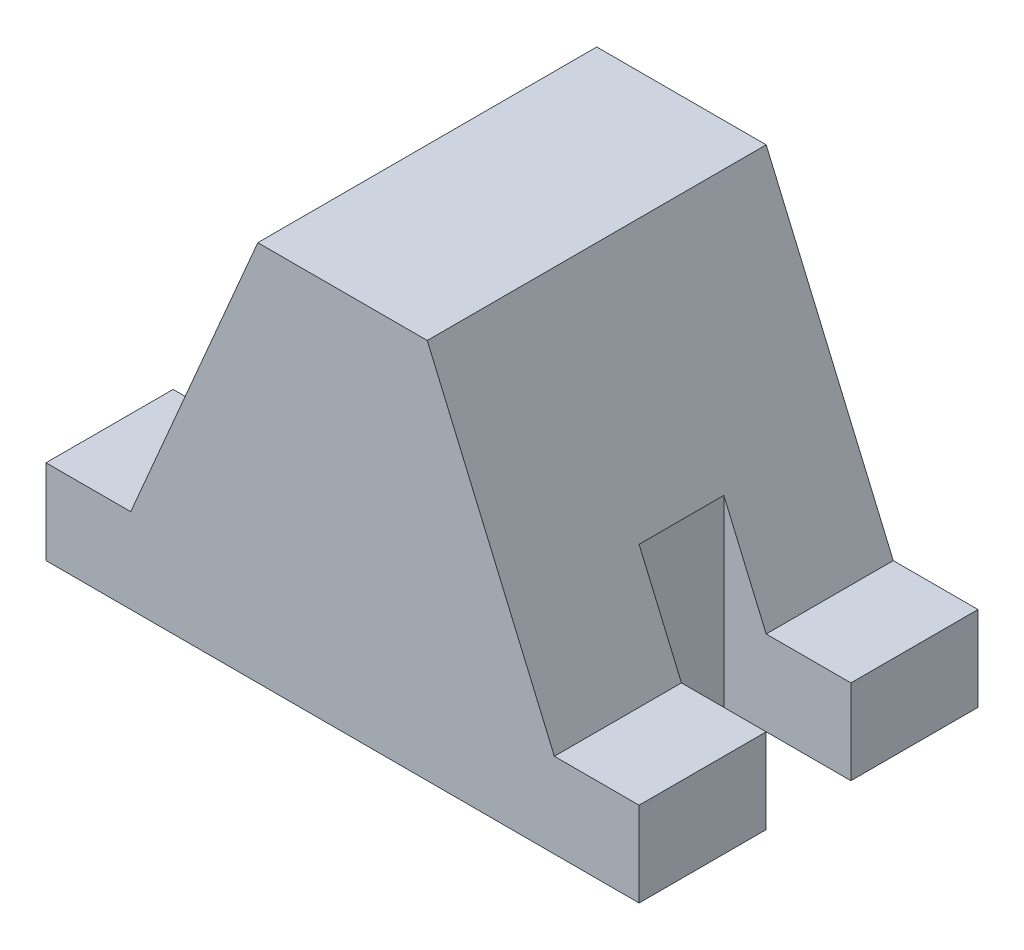
ISO-10303-21;
HEADER;
FILE_DESCRIPTION(('STEP AP214'),'2;1');
FILE_NAME('part.step','',(''),(''),'','','');
FILE_SCHEMA(('AUTOMOTIVE_DESIGN { 1 0 10303 214 1 1 1 1 }'));
ENDSEC;
DATA;
#1=APPLICATION_CONTEXT('core data for automotive mechanical design processes');
#2=APPLICATION_PROTOCOL_DEFINITION('international standard','automotive_design',2000,#1);
#3=PRODUCT_CONTEXT('',#1,'mechanical');
#4=PRODUCT('Part','Part','',(#3));
#5=PRODUCT_RELATED_PRODUCT_CATEGORY('part','',(#4));
#6=PRODUCT_DEFINITION_FORMATION('','',#4);
#7=PRODUCT_DEFINITION_CONTEXT('part definition',#1,'design');
#8=PRODUCT_DEFINITION('design','',#6,#7);
#9=PRODUCT_DEFINITION_SHAPE('','',#8);
#10=(LENGTH_UNIT() NAMED_UNIT(*) SI_UNIT(.MILLI.,.METRE.));
#11=(NAMED_UNIT(*) PLANE_ANGLE_UNIT() SI_UNIT($,.RADIAN.));
#12=(NAMED_UNIT(*) SI_UNIT($,.STERADIAN.) SOLID_ANGLE_UNIT());
#13=UNCERTAINTY_MEASURE_WITH_UNIT(LENGTH_MEASURE(1.E-05),#10,'distance_accuracy_value','');
#14=(GEOMETRIC_REPRESENTATION_CONTEXT(3) GLOBAL_UNCERTAINTY_ASSIGNED_CONTEXT((#13)) GLOBAL_UNIT_ASSIGNED_CONTEXT((#10,
#11,#12)) REPRESENTATION_CONTEXT('',''));
#15=CARTESIAN_POINT('',(0.,0.,0.));
#16=DIRECTION('',(0.,0.,1.));
#17=DIRECTION('',(1.,0.,0.));
#18=AXIS2_PLACEMENT_3D('',#15,#16,#17);
#19=CARTESIAN_POINT('',(-35.,10.,20.));
#20=DIRECTION('',(1.,0.,0.));
#21=DIRECTION('',(0.,0.,-1.));
#22=AXIS2_PLACEMENT_3D('',#19,#20,#21);
#23=PLANE('',#22);
#24=DIRECTION('',(0.,0.,-1.));
#25=VECTOR('',#24,1.);
#26=CARTESIAN_POINT('',(-35.,10.,20.));
#27=LINE('',#26,#25);
#28=CARTESIAN_POINT('',(-35.,10.,20.));
#29=VERTEX_POINT('',#28);
#30=CARTESIAN_POINT('',(-35.,10.,5.00000000000002));
#31=VERTEX_POINT('',#30);
#32=EDGE_CURVE('E177',#29,#31,#27,.T.);
#33=ORIENTED_EDGE('',*,*,#32,.T.);
#34=DIRECTION('',(0.,-1.,0.));
#35=VECTOR('',#34,1.);
#36=CARTESIAN_POINT('',(-35.,45.001,5.00000000000002));
#37=LINE('',#36,#35);
#38=CARTESIAN_POINT('',(-35.,0.,5.00000000000002));
#39=VERTEX_POINT('',#38);
#40=EDGE_CURVE('E158',#31,#39,#37,.T.);
#41=ORIENTED_EDGE('',*,*,#40,.T.);
#42=DIRECTION('',(0.,0.,-1.));
#43=VECTOR('',#42,1.);
#44=CARTESIAN_POINT('',(-35.,0.,20.));
#45=LINE('',#44,#43);
#46=CARTESIAN_POINT('',(-35.,0.,20.));
#47=VERTEX_POINT('',#46);
#48=EDGE_CURVE('E11',#47,#39,#45,.T.);
#49=ORIENTED_EDGE('',*,*,#48,.F.);
#50=DIRECTION('',(0.,-1.,0.));
#51=VECTOR('',#50,1.);
#52=CARTESIAN_POINT('',(-35.,10.,20.));
#53=LINE('',#52,#51);
#54=EDGE_CURVE('E185',#29,#47,#53,.T.);
#55=ORIENTED_EDGE('',*,*,#54,.F.);
#56=EDGE_LOOP('',(#33,#41,#49,#55));
#57=FACE_BOUND('',#56,.T.);
#58=ADVANCED_FACE('F33',(#57),#23,.F.);
#59=CARTESIAN_POINT('',(-25.,10.,20.));
#60=DIRECTION('',(0.,-1.,0.));
#61=DIRECTION('',(1.,0.,0.));
#62=AXIS2_PLACEMENT_3D('',#59,#60,#61);
#63=PLANE('',#62);
#64=DIRECTION('',(0.,0.,-1.));
#65=VECTOR('',#64,1.);
#66=CARTESIAN_POINT('',(-25.,10.,20.));
#67=LINE('',#66,#65);
#68=CARTESIAN_POINT('',(-25.,10.,20.));
#69=VERTEX_POINT('',#68);
#70=CARTESIAN_POINT('',(-25.,10.,5.));
#71=VERTEX_POINT('',#70);
#72=EDGE_CURVE('E180',#69,#71,#67,.T.);
#73=ORIENTED_EDGE('',*,*,#72,.T.);
#74=DIRECTION('',(1.,0.,0.));
#75=VECTOR('',#74,1.);
#76=CARTESIAN_POINT('',(-20.,10.,4.99999999999999));
#77=LINE('',#76,#75);
#78=EDGE_CURVE('E162',#31,#71,#77,.T.);
#79=ORIENTED_EDGE('',*,*,#78,.F.);
#80=ORIENTED_EDGE('',*,*,#32,.F.);
#81=DIRECTION('',(-1.,0.,0.));
#82=VECTOR('',#81,1.);
#83=CARTESIAN_POINT('',(-25.,10.,20.));
#84=LINE('',#83,#82);
#85=EDGE_CURVE('E190',#69,#29,#84,.T.);
#86=ORIENTED_EDGE('',*,*,#85,.F.);
#87=EDGE_LOOP('',(#73,#79,#80,#86));
#88=FACE_BOUND('',#87,.T.);
#89=ADVANCED_FACE('F175',(#88),#63,.F.);
#90=CARTESIAN_POINT('',(35.,0.,20.));
#91=DIRECTION('',(-1.,0.,0.));
#92=DIRECTION('',(0.,0.,1.));
#93=AXIS2_PLACEMENT_3D('',#90,#91,#92);
#94=PLANE('',#93);
#95=DIRECTION('',(0.,0.,-1.));
#96=VECTOR('',#95,1.);
#97=CARTESIAN_POINT('',(35.,0.,20.));
#98=LINE('',#97,#96);
#99=CARTESIAN_POINT('',(35.,0.,20.));
#100=VERTEX_POINT('',#99);
#101=CARTESIAN_POINT('',(35.,0.,5.00000000000002));
#102=VERTEX_POINT('',#101);
#103=EDGE_CURVE('E209',#100,#102,#98,.T.);
#104=ORIENTED_EDGE('',*,*,#103,.T.);
#105=DIRECTION('',(0.,-1.,0.));
#106=VECTOR('',#105,1.);
#107=CARTESIAN_POINT('',(35.,45.001,5.00000000000002));
#108=LINE('',#107,#106);
#109=CARTESIAN_POINT('',(35.,10.,5.00000000000002));
#110=VERTEX_POINT('',#109);
#111=EDGE_CURVE('E279',#110,#102,#108,.T.);
#112=ORIENTED_EDGE('',*,*,#111,.F.);
#113=DIRECTION('',(0.,0.,-1.));
#114=VECTOR('',#113,1.);
#115=CARTESIAN_POINT('',(35.,10.,20.));
#116=LINE('',#115,#114);
#117=CARTESIAN_POINT('',(35.,10.,20.));
#118=VERTEX_POINT('',#117);
#119=EDGE_CURVE('E206',#118,#110,#116,.T.);
#120=ORIENTED_EDGE('',*,*,#119,.F.);
#121=DIRECTION('',(0.,1.,0.));
#122=VECTOR('',#121,1.);
#123=CARTESIAN_POINT('',(35.,0.,20.));
#124=LINE('',#123,#122);
#125=EDGE_CURVE('E261',#100,#118,#124,.T.);
#126=ORIENTED_EDGE('',*,*,#125,.F.);
#127=EDGE_LOOP('',(#104,#112,#120,#126));
#128=FACE_BOUND('',#127,.T.);
#129=ADVANCED_FACE('F333',(#128),#94,.F.);
#130=CARTESIAN_POINT('',(35.,10.,20.));
#131=DIRECTION('',(0.,-1.,0.));
#132=DIRECTION('',(1.,0.,0.));
#133=AXIS2_PLACEMENT_3D('',#130,#131,#132);
#134=PLANE('',#133);
#135=ORIENTED_EDGE('',*,*,#119,.T.);
#136=DIRECTION('',(1.,0.,0.));
#137=VECTOR('',#136,1.);
#138=CARTESIAN_POINT('',(20.,9.99999999999999,4.99999999999999));
#139=LINE('',#138,#137);
#140=CARTESIAN_POINT('',(25.,10.,5.));
#141=VERTEX_POINT('',#140);
#142=EDGE_CURVE('E294',#141,#110,#139,.T.);
#143=ORIENTED_EDGE('',*,*,#142,.F.);
#144=DIRECTION('',(0.,0.,-1.));
#145=VECTOR('',#144,1.);
#146=CARTESIAN_POINT('',(25.,10.,20.));
#147=LINE('',#146,#145);
#148=CARTESIAN_POINT('',(25.,10.,20.));
#149=VERTEX_POINT('',#148);
#150=EDGE_CURVE('E202',#149,#141,#147,.T.);
#151=ORIENTED_EDGE('',*,*,#150,.F.);
#152=DIRECTION('',(-1.,0.,0.));
#153=VECTOR('',#152,1.);
#154=CARTESIAN_POINT('',(35.,10.,20.));
#155=LINE('',#154,#153);
#156=EDGE_CURVE('E267',#118,#149,#155,.T.);
#157=ORIENTED_EDGE('',*,*,#156,.F.);
#158=EDGE_LOOP('',(#135,#143,#151,#157));
#159=FACE_BOUND('',#158,.T.);
#160=ADVANCED_FACE('F338',(#159),#134,.F.);
#161=CARTESIAN_POINT('',(-35.,0.,-4.99999999999998));
#162=VERTEX_POINT('',#161);
#163=CARTESIAN_POINT('',(-35.,0.,-20.));
#164=VERTEX_POINT('',#163);
#165=EDGE_CURVE('E41',#162,#164,#45,.T.);
#166=ORIENTED_EDGE('',*,*,#165,.F.);
#167=DIRECTION('',(0.,-1.,0.));
#168=VECTOR('',#167,1.);
#169=CARTESIAN_POINT('',(-35.,45.001,-4.99999999999998));
#170=LINE('',#169,#168);
#171=CARTESIAN_POINT('',(-35.,10.,-4.99999999999998));
#172=VERTEX_POINT('',#171);
#173=EDGE_CURVE('E169',#172,#162,#170,.T.);
#174=ORIENTED_EDGE('',*,*,#173,.F.);
#175=CARTESIAN_POINT('',(-35.,10.,-20.));
#176=VERTEX_POINT('',#175);
#177=EDGE_CURVE('E187',#172,#176,#27,.T.);
#178=ORIENTED_EDGE('',*,*,#177,.T.);
#179=DIRECTION('',(0.,-1.,0.));
#180=VECTOR('',#179,1.);
#181=CARTESIAN_POINT('',(-35.,10.,-20.));
#182=LINE('',#181,#180);
#183=EDGE_CURVE('E236',#176,#164,#182,.T.);
#184=ORIENTED_EDGE('',*,*,#183,.T.);
#185=EDGE_LOOP('',(#166,#174,#178,#184));
#186=FACE_BOUND('',#185,.T.);
#187=ADVANCED_FACE('F35',(#186),#23,.F.);
#188=CARTESIAN_POINT('',(-35.,0.,20.));
#189=DIRECTION('',(0.,1.,0.));
#190=DIRECTION('',(-1.,0.,0.));
#191=AXIS2_PLACEMENT_3D('',#188,#189,#190);
#192=PLANE('',#191);
#193=ORIENTED_EDGE('',*,*,#48,.T.);
#194=DIRECTION('',(-1.,0.,0.));
#195=VECTOR('',#194,1.);
#196=CARTESIAN_POINT('',(-20.,0.,4.99999999999999));
#197=LINE('',#196,#195);
#198=CARTESIAN_POINT('',(-20.,0.,4.99999999999999));
#199=VERTEX_POINT('',#198);
#200=EDGE_CURVE('E165',#199,#39,#197,.T.);
#201=ORIENTED_EDGE('',*,*,#200,.F.);
#202=DIRECTION('',(0.,0.,1.));
#203=VECTOR('',#202,1.);
#204=CARTESIAN_POINT('',(-20.,0.,4.99999999999999));
#205=LINE('',#204,#203);
#206=CARTESIAN_POINT('',(-20.,0.,-4.99999999999996));
#207=VERTEX_POINT('',#206);
#208=EDGE_CURVE('E170',#207,#199,#205,.T.);
#209=ORIENTED_EDGE('',*,*,#208,.F.);
#210=DIRECTION('',(1.,0.,0.));
#211=VECTOR('',#210,1.);
#212=CARTESIAN_POINT('',(-20.,0.,-4.99999999999996));
#213=LINE('',#212,#211);
#214=EDGE_CURVE('E309',#162,#207,#213,.T.);
#215=ORIENTED_EDGE('',*,*,#214,.F.);
#216=ORIENTED_EDGE('',*,*,#165,.T.);
#217=DIRECTION('',(1.,0.,0.));
#218=VECTOR('',#217,1.);
#219=CARTESIAN_POINT('',(-35.,0.,-20.));
#220=LINE('',#219,#218);
#221=CARTESIAN_POINT('',(35.,0.,-20.));
#222=VERTEX_POINT('',#221);
#223=EDGE_CURVE('E229',#164,#222,#220,.T.);
#224=ORIENTED_EDGE('',*,*,#223,.T.);
#225=CARTESIAN_POINT('',(35.,0.,-4.99999999999998));
#226=VERTEX_POINT('',#225);
#227=EDGE_CURVE('E208',#226,#222,#98,.T.);
#228=ORIENTED_EDGE('',*,*,#227,.F.);
#229=DIRECTION('',(1.,0.,0.));
#230=VECTOR('',#229,1.);
#231=CARTESIAN_POINT('',(20.,0.,-4.99999999999996));
#232=LINE('',#231,#230);
#233=CARTESIAN_POINT('',(20.,0.,-4.99999999999996));
#234=VERTEX_POINT('',#233);
#235=EDGE_CURVE('E289',#234,#226,#232,.T.);
#236=ORIENTED_EDGE('',*,*,#235,.F.);
#237=DIRECTION('',(0.,0.,-1.));
#238=VECTOR('',#237,1.);
#239=CARTESIAN_POINT('',(20.,0.,4.99999999999999));
#240=LINE('',#239,#238);
#241=CARTESIAN_POINT('',(20.,0.,4.99999999999999));
#242=VERTEX_POINT('',#241);
#243=EDGE_CURVE('E291',#242,#234,#240,.T.);
#244=ORIENTED_EDGE('',*,*,#243,.F.);
#245=DIRECTION('',(-1.,0.,0.));
#246=VECTOR('',#245,1.);
#247=CARTESIAN_POINT('',(20.,0.,4.99999999999999));
#248=LINE('',#247,#246);
#249=EDGE_CURVE('E284',#102,#242,#248,.T.);
#250=ORIENTED_EDGE('',*,*,#249,.F.);
#251=ORIENTED_EDGE('',*,*,#103,.F.);
#252=DIRECTION('',(1.,0.,0.));
#253=VECTOR('',#252,1.);
#254=CARTESIAN_POINT('',(-35.,0.,20.));
#255=LINE('',#254,#253);
#256=EDGE_CURVE('E258',#47,#100,#255,.T.);
#257=ORIENTED_EDGE('',*,*,#256,.F.);
#258=EDGE_LOOP('',(#193,#201,#209,#215,#216,#224,#228,#236,#244,#250,#251,#257));
#259=FACE_BOUND('',#258,.T.);
#260=ADVANCED_FACE('F230',(#259),#192,.F.);
#261=CARTESIAN_POINT('',(35.,10.,-4.99999999999998));
#262=VERTEX_POINT('',#261);
#263=CARTESIAN_POINT('',(35.,10.,-20.));
#264=VERTEX_POINT('',#263);
#265=EDGE_CURVE('E205',#262,#264,#116,.T.);
#266=ORIENTED_EDGE('',*,*,#265,.F.);
#267=DIRECTION('',(0.,-1.,0.));
#268=VECTOR('',#267,1.);
#269=CARTESIAN_POINT('',(35.,45.001,-4.99999999999998));
#270=LINE('',#269,#268);
#271=EDGE_CURVE('E225',#262,#226,#270,.T.);
#272=ORIENTED_EDGE('',*,*,#271,.T.);
#273=ORIENTED_EDGE('',*,*,#227,.T.);
#274=DIRECTION('',(0.,1.,0.));
#275=VECTOR('',#274,1.);
#276=CARTESIAN_POINT('',(35.,0.,-20.));
#277=LINE('',#276,#275);
#278=EDGE_CURVE('E223',#222,#264,#277,.T.);
#279=ORIENTED_EDGE('',*,*,#278,.T.);
#280=EDGE_LOOP('',(#266,#272,#273,#279));
#281=FACE_BOUND('',#280,.T.);
#282=ADVANCED_FACE('F221',(#281),#94,.F.);
#283=CARTESIAN_POINT('',(25.,10.,-4.99999999999997));
#284=VERTEX_POINT('',#283);
#285=CARTESIAN_POINT('',(25.,10.,-20.));
#286=VERTEX_POINT('',#285);
#287=EDGE_CURVE('E201',#284,#286,#147,.T.);
#288=ORIENTED_EDGE('',*,*,#287,.F.);
#289=DIRECTION('',(-1.,0.,0.));
#290=VECTOR('',#289,1.);
#291=CARTESIAN_POINT('',(20.,9.99999999999999,-4.99999999999996));
#292=LINE('',#291,#290);
#293=EDGE_CURVE('E56',#262,#284,#292,.T.);
#294=ORIENTED_EDGE('',*,*,#293,.F.);
#295=ORIENTED_EDGE('',*,*,#265,.T.);
#296=DIRECTION('',(-1.,0.,0.));
#297=VECTOR('',#296,1.);
#298=CARTESIAN_POINT('',(35.,10.,-20.));
#299=LINE('',#298,#297);
#300=EDGE_CURVE('E241',#264,#286,#299,.T.);
#301=ORIENTED_EDGE('',*,*,#300,.T.);
#302=EDGE_LOOP('',(#288,#294,#295,#301));
#303=FACE_BOUND('',#302,.T.);
#304=ADVANCED_FACE('F345',(#303),#134,.F.);
#305=CARTESIAN_POINT('',(25.,10.,20.));
#306=DIRECTION('',(-0.919145030018058,-0.393919298579168,0.));
#307=DIRECTION('',(0.393919298579168,-0.919145030018058,0.));
#308=AXIS2_PLACEMENT_3D('',#305,#306,#307);
#309=PLANE('',#308);
#310=ORIENTED_EDGE('',*,*,#150,.T.);
#311=DIRECTION('',(0.393919298579168,-0.919145030018058,0.));
#312=VECTOR('',#311,1.);
#313=CARTESIAN_POINT('',(11.5513620689655,41.3801551724138,4.99999999999997));
#314=LINE('',#313,#312);
#315=CARTESIAN_POINT('',(20.,21.6666666666667,4.99999999999999));
#316=VERTEX_POINT('',#315);
#317=EDGE_CURVE('E296',#316,#141,#314,.T.);
#318=ORIENTED_EDGE('',*,*,#317,.F.);
#319=DIRECTION('',(0.,0.,1.));
#320=VECTOR('',#319,1.);
#321=CARTESIAN_POINT('',(20.,21.6666666666667,4.99999999999999));
#322=LINE('',#321,#320);
#323=CARTESIAN_POINT('',(20.,21.6666666666667,-4.99999999999996));
#324=VERTEX_POINT('',#323);
#325=EDGE_CURVE('E298',#324,#316,#322,.T.);
#326=ORIENTED_EDGE('',*,*,#325,.F.);
#327=DIRECTION('',(-0.393919298579168,0.919145030018058,0.));
#328=VECTOR('',#327,1.);
#329=CARTESIAN_POINT('',(11.5513620689655,41.3801551724138,-4.99999999999995));
#330=LINE('',#329,#328);
#331=EDGE_CURVE('E276',#284,#324,#330,.T.);
#332=ORIENTED_EDGE('',*,*,#331,.F.);
#333=ORIENTED_EDGE('',*,*,#287,.T.);
#334=DIRECTION('',(-0.393919298579168,0.919145030018058,0.));
#335=VECTOR('',#334,1.);
#336=CARTESIAN_POINT('',(25.,10.,-20.));
#337=LINE('',#336,#335);
#338=CARTESIAN_POINT('',(10.,45.,-20.));
#339=VERTEX_POINT('',#338);
#340=EDGE_CURVE('E243',#286,#339,#337,.T.);
#341=ORIENTED_EDGE('',*,*,#340,.T.);
#342=DIRECTION('',(0.,0.,-1.));
#343=VECTOR('',#342,1.);
#344=CARTESIAN_POINT('',(10.,45.,20.));
#345=LINE('',#344,#343);
#346=CARTESIAN_POINT('',(10.,45.,20.));
#347=VERTEX_POINT('',#346);
#348=EDGE_CURVE('E198',#347,#339,#345,.T.);
#349=ORIENTED_EDGE('',*,*,#348,.F.);
#350=DIRECTION('',(-0.393919298579168,0.919145030018058,0.));
#351=VECTOR('',#350,1.);
#352=CARTESIAN_POINT('',(25.,10.,20.));
#353=LINE('',#352,#351);
#354=EDGE_CURVE('E269',#149,#347,#353,.T.);
#355=ORIENTED_EDGE('',*,*,#354,.F.);
#356=EDGE_LOOP('',(#310,#318,#326,#332,#333,#341,#349,#355));
#357=FACE_BOUND('',#356,.T.);
#358=ADVANCED_FACE('F352',(#357),#309,.F.);
#359=CARTESIAN_POINT('',(10.,45.,20.));
#360=DIRECTION('',(0.,-1.,0.));
#361=DIRECTION('',(0.,0.,-1.));
#362=AXIS2_PLACEMENT_3D('',#359,#360,#361);
#363=PLANE('',#362);
#364=DIRECTION('',(-1.,0.,0.));
#365=VECTOR('',#364,1.);
#366=CARTESIAN_POINT('',(10.,45.,-20.));
#367=LINE('',#366,#365);
#368=CARTESIAN_POINT('',(-10.,45.,-20.));
#369=VERTEX_POINT('',#368);
#370=EDGE_CURVE('E248',#339,#369,#367,.T.);
#371=ORIENTED_EDGE('',*,*,#370,.T.);
#372=DIRECTION('',(0.,0.,-1.));
#373=VECTOR('',#372,1.);
#374=CARTESIAN_POINT('',(-10.,45.,20.));
#375=LINE('',#374,#373);
#376=CARTESIAN_POINT('',(-10.,45.,20.));
#377=VERTEX_POINT('',#376);
#378=EDGE_CURVE('E195',#377,#369,#375,.T.);
#379=ORIENTED_EDGE('',*,*,#378,.F.);
#380=DIRECTION('',(-1.,0.,0.));
#381=VECTOR('',#380,1.);
#382=CARTESIAN_POINT('',(10.,45.,20.));
#383=LINE('',#382,#381);
#384=EDGE_CURVE('E271',#347,#377,#383,.T.);
#385=ORIENTED_EDGE('',*,*,#384,.F.);
#386=ORIENTED_EDGE('',*,*,#348,.T.);
#387=EDGE_LOOP('',(#371,#379,#385,#386));
#388=FACE_BOUND('',#387,.T.);
#389=ADVANCED_FACE('F329',(#388),#363,.F.);
#390=CARTESIAN_POINT('',(-10.,45.,20.));
#391=DIRECTION('',(0.919145030018058,-0.393919298579168,0.));
#392=DIRECTION('',(0.393919298579168,0.919145030018058,0.));
#393=AXIS2_PLACEMENT_3D('',#390,#391,#392);
#394=PLANE('',#393);
#395=DIRECTION('',(0.,0.,-1.));
#396=VECTOR('',#395,1.);
#397=CARTESIAN_POINT('',(-20.,21.6666666666667,4.99999999999999));
#398=LINE('',#397,#396);
#399=CARTESIAN_POINT('',(-20.,21.6666666666667,4.99999999999999));
#400=VERTEX_POINT('',#399);
#401=CARTESIAN_POINT('',(-20.,21.6666666666666,-4.99999999999996));
#402=VERTEX_POINT('',#401);
#403=EDGE_CURVE('E181',#400,#402,#398,.T.);
#404=ORIENTED_EDGE('',*,*,#403,.F.);
#405=DIRECTION('',(0.393919298579168,0.919145030018058,0.));
#406=VECTOR('',#405,1.);
#407=CARTESIAN_POINT('',(-11.5513620689655,41.3801551724138,4.99999999999997));
#408=LINE('',#407,#406);
#409=EDGE_CURVE('E313',#71,#400,#408,.T.);
#410=ORIENTED_EDGE('',*,*,#409,.F.);
#411=ORIENTED_EDGE('',*,*,#72,.F.);
#412=DIRECTION('',(-0.393919298579168,-0.919145030018058,0.));
#413=VECTOR('',#412,1.);
#414=CARTESIAN_POINT('',(-10.,45.,20.));
#415=LINE('',#414,#413);
#416=EDGE_CURVE('E273',#377,#69,#415,.T.);
#417=ORIENTED_EDGE('',*,*,#416,.F.);
#418=ORIENTED_EDGE('',*,*,#378,.T.);
#419=DIRECTION('',(-0.393919298579168,-0.919145030018058,0.));
#420=VECTOR('',#419,1.);
#421=CARTESIAN_POINT('',(-10.,45.,-20.));
#422=LINE('',#421,#420);
#423=CARTESIAN_POINT('',(-25.,10.,-20.));
#424=VERTEX_POINT('',#423);
#425=EDGE_CURVE('E249',#369,#424,#422,.T.);
#426=ORIENTED_EDGE('',*,*,#425,.T.);
#427=CARTESIAN_POINT('',(-25.,10.,-4.99999999999997));
#428=VERTEX_POINT('',#427);
#429=EDGE_CURVE('E186',#428,#424,#67,.T.);
#430=ORIENTED_EDGE('',*,*,#429,.F.);
#431=DIRECTION('',(-0.393919298579168,-0.919145030018058,0.));
#432=VECTOR('',#431,1.);
#433=CARTESIAN_POINT('',(-11.5513620689655,41.3801551724138,-4.99999999999995));
#434=LINE('',#433,#432);
#435=EDGE_CURVE('E48',#402,#428,#434,.T.);
#436=ORIENTED_EDGE('',*,*,#435,.F.);
#437=EDGE_LOOP('',(#404,#410,#411,#417,#418,#426,#430,#436));
#438=FACE_BOUND('',#437,.T.);
#439=ADVANCED_FACE('F322',(#438),#394,.F.);
#440=ORIENTED_EDGE('',*,*,#177,.F.);
#441=DIRECTION('',(-1.,0.,0.));
#442=VECTOR('',#441,1.);
#443=CARTESIAN_POINT('',(-20.,10.,-4.99999999999996));
#444=LINE('',#443,#442);
#445=EDGE_CURVE('E182',#428,#172,#444,.T.);
#446=ORIENTED_EDGE('',*,*,#445,.F.);
#447=ORIENTED_EDGE('',*,*,#429,.T.);
#448=DIRECTION('',(-1.,0.,0.));
#449=VECTOR('',#448,1.);
#450=CARTESIAN_POINT('',(-25.,10.,-20.));
#451=LINE('',#450,#449);
#452=EDGE_CURVE('E192',#424,#176,#451,.T.);
#453=ORIENTED_EDGE('',*,*,#452,.T.);
#454=EDGE_LOOP('',(#440,#446,#447,#453));
#455=FACE_BOUND('',#454,.T.);
#456=ADVANCED_FACE('F319',(#455),#63,.F.);
#457=CARTESIAN_POINT('',(0.,0.,20.));
#458=DIRECTION('',(0.,0.,1.));
#459=DIRECTION('',(1.,0.,0.));
#460=AXIS2_PLACEMENT_3D('',#457,#458,#459);
#461=PLANE('',#460);
#462=ORIENTED_EDGE('',*,*,#54,.T.);
#463=ORIENTED_EDGE('',*,*,#256,.T.);
#464=ORIENTED_EDGE('',*,*,#125,.T.);
#465=ORIENTED_EDGE('',*,*,#156,.T.);
#466=ORIENTED_EDGE('',*,*,#354,.T.);
#467=ORIENTED_EDGE('',*,*,#384,.T.);
#468=ORIENTED_EDGE('',*,*,#416,.T.);
#469=ORIENTED_EDGE('',*,*,#85,.T.);
#470=EDGE_LOOP('',(#462,#463,#464,#465,#466,#467,#468,#469));
#471=FACE_BOUND('',#470,.T.);
#472=ADVANCED_FACE('F321',(#471),#461,.T.);
#473=CARTESIAN_POINT('',(0.,0.,-20.));
#474=DIRECTION('',(0.,0.,1.));
#475=DIRECTION('',(1.,0.,0.));
#476=AXIS2_PLACEMENT_3D('',#473,#474,#475);
#477=PLANE('',#476);
#478=ORIENTED_EDGE('',*,*,#183,.F.);
#479=ORIENTED_EDGE('',*,*,#452,.F.);
#480=ORIENTED_EDGE('',*,*,#425,.F.);
#481=ORIENTED_EDGE('',*,*,#370,.F.);
#482=ORIENTED_EDGE('',*,*,#340,.F.);
#483=ORIENTED_EDGE('',*,*,#300,.F.);
#484=ORIENTED_EDGE('',*,*,#278,.F.);
#485=ORIENTED_EDGE('',*,*,#223,.F.);
#486=EDGE_LOOP('',(#478,#479,#480,#481,#482,#483,#484,#485));
#487=FACE_BOUND('',#486,.T.);
#488=ADVANCED_FACE('F238',(#487),#477,.F.);
#489=CARTESIAN_POINT('',(20.,45.001,4.99999999999999));
#490=DIRECTION('',(-1.,0.,0.));
#491=DIRECTION('',(0.,-1.,0.));
#492=AXIS2_PLACEMENT_3D('',#489,#490,#491);
#493=PLANE('',#492);
#494=ORIENTED_EDGE('',*,*,#325,.T.);
#495=DIRECTION('',(0.,-1.,0.));
#496=VECTOR('',#495,1.);
#497=CARTESIAN_POINT('',(20.,45.001,4.99999999999999));
#498=LINE('',#497,#496);
#499=EDGE_CURVE('E277',#316,#242,#498,.T.);
#500=ORIENTED_EDGE('',*,*,#499,.T.);
#501=ORIENTED_EDGE('',*,*,#243,.T.);
#502=DIRECTION('',(0.,-1.,0.));
#503=VECTOR('',#502,1.);
#504=CARTESIAN_POINT('',(20.,45.001,-4.99999999999996));
#505=LINE('',#504,#503);
#506=EDGE_CURVE('E282',#324,#234,#505,.T.);
#507=ORIENTED_EDGE('',*,*,#506,.F.);
#508=EDGE_LOOP('',(#494,#500,#501,#507));
#509=FACE_BOUND('',#508,.T.);
#510=ADVANCED_FACE('F363',(#509),#493,.F.);
#511=CARTESIAN_POINT('',(20.,45.001,4.99999999999999));
#512=DIRECTION('',(0.,0.,1.));
#513=DIRECTION('',(1.,0.,0.));
#514=AXIS2_PLACEMENT_3D('',#511,#512,#513);
#515=PLANE('',#514);
#516=ORIENTED_EDGE('',*,*,#142,.T.);
#517=ORIENTED_EDGE('',*,*,#111,.T.);
#518=ORIENTED_EDGE('',*,*,#249,.T.);
#519=ORIENTED_EDGE('',*,*,#499,.F.);
#520=ORIENTED_EDGE('',*,*,#317,.T.);
#521=EDGE_LOOP('',(#516,#517,#518,#519,#520));
#522=FACE_BOUND('',#521,.T.);
#523=ADVANCED_FACE('F368',(#522),#515,.F.);
#524=CARTESIAN_POINT('',(20.,45.001,-4.99999999999996));
#525=DIRECTION('',(0.,0.,-1.));
#526=DIRECTION('',(-1.,0.,0.));
#527=AXIS2_PLACEMENT_3D('',#524,#525,#526);
#528=PLANE('',#527);
#529=ORIENTED_EDGE('',*,*,#293,.T.);
#530=ORIENTED_EDGE('',*,*,#331,.T.);
#531=ORIENTED_EDGE('',*,*,#506,.T.);
#532=ORIENTED_EDGE('',*,*,#235,.T.);
#533=ORIENTED_EDGE('',*,*,#271,.F.);
#534=EDGE_LOOP('',(#529,#530,#531,#532,#533));
#535=FACE_BOUND('',#534,.T.);
#536=ADVANCED_FACE('F365',(#535),#528,.F.);
#537=CARTESIAN_POINT('',(-20.,45.001,4.99999999999999));
#538=DIRECTION('',(0.,0.,1.));
#539=DIRECTION('',(1.,0.,0.));
#540=AXIS2_PLACEMENT_3D('',#537,#538,#539);
#541=PLANE('',#540);
#542=ORIENTED_EDGE('',*,*,#409,.T.);
#543=DIRECTION('',(0.,-1.,0.));
#544=VECTOR('',#543,1.);
#545=CARTESIAN_POINT('',(-20.,45.001,4.99999999999999));
#546=LINE('',#545,#544);
#547=EDGE_CURVE('E301',#400,#199,#546,.T.);
#548=ORIENTED_EDGE('',*,*,#547,.T.);
#549=ORIENTED_EDGE('',*,*,#200,.T.);
#550=ORIENTED_EDGE('',*,*,#40,.F.);
#551=ORIENTED_EDGE('',*,*,#78,.T.);
#552=EDGE_LOOP('',(#542,#548,#549,#550,#551));
#553=FACE_BOUND('',#552,.T.);
#554=ADVANCED_FACE('F161',(#553),#541,.F.);
#555=CARTESIAN_POINT('',(-20.,45.001,4.99999999999999));
#556=DIRECTION('',(1.,0.,0.));
#557=DIRECTION('',(0.,1.,0.));
#558=AXIS2_PLACEMENT_3D('',#555,#556,#557);
#559=PLANE('',#558);
#560=ORIENTED_EDGE('',*,*,#403,.T.);
#561=DIRECTION('',(0.,-1.,0.));
#562=VECTOR('',#561,1.);
#563=CARTESIAN_POINT('',(-20.,45.001,-4.99999999999996));
#564=LINE('',#563,#562);
#565=EDGE_CURVE('E304',#402,#207,#564,.T.);
#566=ORIENTED_EDGE('',*,*,#565,.T.);
#567=ORIENTED_EDGE('',*,*,#208,.T.);
#568=ORIENTED_EDGE('',*,*,#547,.F.);
#569=EDGE_LOOP('',(#560,#566,#567,#568));
#570=FACE_BOUND('',#569,.T.);
#571=ADVANCED_FACE('F376',(#570),#559,.F.);
#572=CARTESIAN_POINT('',(-20.,45.001,-4.99999999999996));
#573=DIRECTION('',(0.,0.,-1.));
#574=DIRECTION('',(-1.,0.,0.));
#575=AXIS2_PLACEMENT_3D('',#572,#573,#574);
#576=PLANE('',#575);
#577=ORIENTED_EDGE('',*,*,#435,.T.);
#578=ORIENTED_EDGE('',*,*,#445,.T.);
#579=ORIENTED_EDGE('',*,*,#173,.T.);
#580=ORIENTED_EDGE('',*,*,#214,.T.);
#581=ORIENTED_EDGE('',*,*,#565,.F.);
#582=EDGE_LOOP('',(#577,#578,#579,#580,#581));
#583=FACE_BOUND('',#582,.T.);
#584=ADVANCED_FACE('F318',(#583),#576,.F.);
#585=CLOSED_SHELL('',(#58,#89,#129,#160,#187,#260,#282,#304,#358,#389,#439,#456,#472,#488,#510,
#523,#536,#554,#571,#584));
#586=MANIFOLD_SOLID_BREP('B2',#585);
#587=ADVANCED_BREP_SHAPE_REPRESENTATION('',(#18,#586),#14);
#588=SHAPE_DEFINITION_REPRESENTATION(#9,#587);
ENDSEC;
END-ISO-10303-21;
